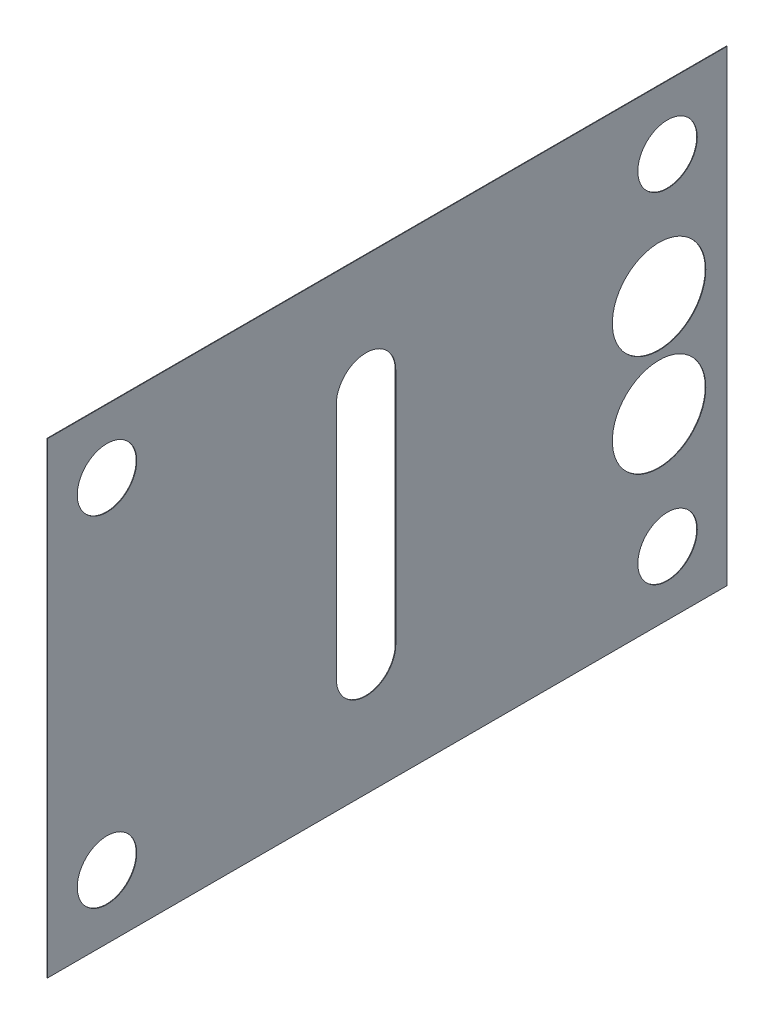
ISO-10303-21;
HEADER;
FILE_DESCRIPTION(('STEP AP214'),'2;1');
FILE_NAME('part.step','',(''),(''),'','','');
FILE_SCHEMA(('AUTOMOTIVE_DESIGN { 1 0 10303 214 1 1 1 1 }'));
ENDSEC;
DATA;
#1=APPLICATION_CONTEXT('core data for automotive mechanical design processes');
#2=APPLICATION_PROTOCOL_DEFINITION('international standard','automotive_design',2000,#1);
#3=PRODUCT_CONTEXT('',#1,'mechanical');
#4=PRODUCT('Part','Part','',(#3));
#5=PRODUCT_RELATED_PRODUCT_CATEGORY('part','',(#4));
#6=PRODUCT_DEFINITION_FORMATION('','',#4);
#7=PRODUCT_DEFINITION_CONTEXT('part definition',#1,'design');
#8=PRODUCT_DEFINITION('design','',#6,#7);
#9=PRODUCT_DEFINITION_SHAPE('','',#8);
#10=(LENGTH_UNIT() NAMED_UNIT(*) SI_UNIT(.MILLI.,.METRE.));
#11=(NAMED_UNIT(*) PLANE_ANGLE_UNIT() SI_UNIT($,.RADIAN.));
#12=(NAMED_UNIT(*) SI_UNIT($,.STERADIAN.) SOLID_ANGLE_UNIT());
#13=UNCERTAINTY_MEASURE_WITH_UNIT(LENGTH_MEASURE(1.E-05),#10,'distance_accuracy_value','');
#14=(GEOMETRIC_REPRESENTATION_CONTEXT(3) GLOBAL_UNCERTAINTY_ASSIGNED_CONTEXT((#13)) GLOBAL_UNIT_ASSIGNED_CONTEXT((#10,
#11,#12)) REPRESENTATION_CONTEXT('',''));
#15=CARTESIAN_POINT('',(0.,0.,0.));
#16=DIRECTION('',(0.,0.,1.));
#17=DIRECTION('',(1.,0.,0.));
#18=AXIS2_PLACEMENT_3D('',#15,#16,#17);
#19=CARTESIAN_POINT('',(0.127,55.,80.));
#20=DIRECTION('',(0.,0.,-1.));
#21=DIRECTION('',(-1.,0.,0.));
#22=AXIS2_PLACEMENT_3D('',#19,#20,#21);
#23=PLANE('',#22);
#24=DIRECTION('',(0.,-1.,0.));
#25=VECTOR('',#24,1.);
#26=CARTESIAN_POINT('',(0.,55.,80.));
#27=LINE('',#26,#25);
#28=CARTESIAN_POINT('',(0.,55.,80.));
#29=VERTEX_POINT('',#28);
#30=CARTESIAN_POINT('',(0.,-55.,80.));
#31=VERTEX_POINT('',#30);
#32=EDGE_CURVE('E161',#29,#31,#27,.T.);
#33=ORIENTED_EDGE('',*,*,#32,.T.);
#34=DIRECTION('',(-1.,0.,0.));
#35=VECTOR('',#34,1.);
#36=CARTESIAN_POINT('',(0.127,-55.,80.));
#37=LINE('',#36,#35);
#38=CARTESIAN_POINT('',(0.127,-55.,80.));
#39=VERTEX_POINT('',#38);
#40=EDGE_CURVE('E11',#39,#31,#37,.T.);
#41=ORIENTED_EDGE('',*,*,#40,.F.);
#42=DIRECTION('',(0.,-1.,0.));
#43=VECTOR('',#42,1.);
#44=CARTESIAN_POINT('',(0.127,55.,80.));
#45=LINE('',#44,#43);
#46=CARTESIAN_POINT('',(0.127,55.,80.));
#47=VERTEX_POINT('',#46);
#48=EDGE_CURVE('E162',#47,#39,#45,.T.);
#49=ORIENTED_EDGE('',*,*,#48,.F.);
#50=DIRECTION('',(-1.,0.,0.));
#51=VECTOR('',#50,1.);
#52=CARTESIAN_POINT('',(0.127,55.,80.));
#53=LINE('',#52,#51);
#54=EDGE_CURVE('E172',#47,#29,#53,.T.);
#55=ORIENTED_EDGE('',*,*,#54,.T.);
#56=EDGE_LOOP('',(#33,#41,#49,#55));
#57=FACE_BOUND('',#56,.T.);
#58=ADVANCED_FACE('F34',(#57),#23,.F.);
#59=CARTESIAN_POINT('',(0.127,-55.,80.));
#60=DIRECTION('',(0.,1.,0.));
#61=DIRECTION('',(0.,0.,1.));
#62=AXIS2_PLACEMENT_3D('',#59,#60,#61);
#63=PLANE('',#62);
#64=DIRECTION('',(0.,0.,-1.));
#65=VECTOR('',#64,1.);
#66=CARTESIAN_POINT('',(0.,-55.,80.));
#67=LINE('',#66,#65);
#68=CARTESIAN_POINT('',(0.,-55.,-80.));
#69=VERTEX_POINT('',#68);
#70=EDGE_CURVE('E175',#31,#69,#67,.T.);
#71=ORIENTED_EDGE('',*,*,#70,.T.);
#72=DIRECTION('',(-1.,0.,0.));
#73=VECTOR('',#72,1.);
#74=CARTESIAN_POINT('',(0.127,-55.,-80.));
#75=LINE('',#74,#73);
#76=CARTESIAN_POINT('',(0.127,-55.,-80.));
#77=VERTEX_POINT('',#76);
#78=EDGE_CURVE('E41',#77,#69,#75,.T.);
#79=ORIENTED_EDGE('',*,*,#78,.F.);
#80=DIRECTION('',(0.,0.,-1.));
#81=VECTOR('',#80,1.);
#82=CARTESIAN_POINT('',(0.127,-55.,80.));
#83=LINE('',#82,#81);
#84=EDGE_CURVE('E165',#39,#77,#83,.T.);
#85=ORIENTED_EDGE('',*,*,#84,.F.);
#86=ORIENTED_EDGE('',*,*,#40,.T.);
#87=EDGE_LOOP('',(#71,#79,#85,#86));
#88=FACE_BOUND('',#87,.T.);
#89=ADVANCED_FACE('F204',(#88),#63,.F.);
#90=CARTESIAN_POINT('',(0.127,55.,-80.));
#91=DIRECTION('',(0.,0.,1.));
#92=DIRECTION('',(0.,-1.,0.));
#93=AXIS2_PLACEMENT_3D('',#90,#91,#92);
#94=PLANE('',#93);
#95=DIRECTION('',(0.,1.,0.));
#96=VECTOR('',#95,1.);
#97=CARTESIAN_POINT('',(0.,55.,-80.));
#98=LINE('',#97,#96);
#99=CARTESIAN_POINT('',(0.,55.,-80.));
#100=VERTEX_POINT('',#99);
#101=EDGE_CURVE('E177',#69,#100,#98,.T.);
#102=ORIENTED_EDGE('',*,*,#101,.T.);
#103=DIRECTION('',(-1.,0.,0.));
#104=VECTOR('',#103,1.);
#105=CARTESIAN_POINT('',(0.127,55.,-80.));
#106=LINE('',#105,#104);
#107=CARTESIAN_POINT('',(0.127,55.,-80.));
#108=VERTEX_POINT('',#107);
#109=EDGE_CURVE('E182',#108,#100,#106,.T.);
#110=ORIENTED_EDGE('',*,*,#109,.F.);
#111=DIRECTION('',(0.,1.,0.));
#112=VECTOR('',#111,1.);
#113=CARTESIAN_POINT('',(0.127,55.,-80.));
#114=LINE('',#113,#112);
#115=EDGE_CURVE('E168',#77,#108,#114,.T.);
#116=ORIENTED_EDGE('',*,*,#115,.F.);
#117=ORIENTED_EDGE('',*,*,#78,.T.);
#118=EDGE_LOOP('',(#102,#110,#116,#117));
#119=FACE_BOUND('',#118,.T.);
#120=ADVANCED_FACE('F189',(#119),#94,.F.);
#121=CARTESIAN_POINT('',(0.127,55.,80.));
#122=DIRECTION('',(0.,-1.,0.));
#123=DIRECTION('',(0.,0.,-1.));
#124=AXIS2_PLACEMENT_3D('',#121,#122,#123);
#125=PLANE('',#124);
#126=DIRECTION('',(0.,0.,1.));
#127=VECTOR('',#126,1.);
#128=CARTESIAN_POINT('',(0.,55.,80.));
#129=LINE('',#128,#127);
#130=EDGE_CURVE('E166',#100,#29,#129,.T.);
#131=ORIENTED_EDGE('',*,*,#130,.T.);
#132=ORIENTED_EDGE('',*,*,#54,.F.);
#133=DIRECTION('',(0.,0.,1.));
#134=VECTOR('',#133,1.);
#135=CARTESIAN_POINT('',(0.127,55.,80.));
#136=LINE('',#135,#134);
#137=EDGE_CURVE('E170',#108,#47,#136,.T.);
#138=ORIENTED_EDGE('',*,*,#137,.F.);
#139=ORIENTED_EDGE('',*,*,#109,.T.);
#140=EDGE_LOOP('',(#131,#132,#138,#139));
#141=FACE_BOUND('',#140,.T.);
#142=ADVANCED_FACE('F197',(#141),#125,.F.);
#143=CARTESIAN_POINT('',(0.127,0.,0.));
#144=DIRECTION('',(1.,0.,0.));
#145=DIRECTION('',(0.,0.,-1.));
#146=AXIS2_PLACEMENT_3D('',#143,#144,#145);
#147=PLANE('',#146);
#148=CARTESIAN_POINT('',(0.127,12.,-64.));
#149=DIRECTION('',(1.,0.,0.));
#150=DIRECTION('',(0.,0.,-1.));
#151=AXIS2_PLACEMENT_3D('',#148,#149,#150);
#152=CIRCLE('',#151,11.);
#153=CARTESIAN_POINT('',(0.127,12.,-75.));
#154=VERTEX_POINT('',#153);
#155=EDGE_CURVE('E262',#154,#154,#152,.T.);
#156=ORIENTED_EDGE('',*,*,#155,.F.);
#157=EDGE_LOOP('',(#156));
#158=FACE_BOUND('',#157,.T.);
#159=CARTESIAN_POINT('',(0.127,-12.,-64.));
#160=DIRECTION('',(1.,0.,0.));
#161=DIRECTION('',(0.,0.,-1.));
#162=AXIS2_PLACEMENT_3D('',#159,#160,#161);
#163=CIRCLE('',#162,11.);
#164=CARTESIAN_POINT('',(0.127,-12.,-75.));
#165=VERTEX_POINT('',#164);
#166=EDGE_CURVE('E264',#165,#165,#163,.T.);
#167=ORIENTED_EDGE('',*,*,#166,.F.);
#168=EDGE_LOOP('',(#167));
#169=FACE_BOUND('',#168,.T.);
#170=CARTESIAN_POINT('',(0.127,28.,5.));
#171=DIRECTION('',(1.,0.,0.));
#172=DIRECTION('',(0.,0.,-1.));
#173=AXIS2_PLACEMENT_3D('',#170,#171,#172);
#174=CIRCLE('',#173,6.99999999999999);
#175=CARTESIAN_POINT('',(0.127,28.,-1.99999999999998));
#176=VERTEX_POINT('',#175);
#177=CARTESIAN_POINT('',(0.127,28.,12.));
#178=VERTEX_POINT('',#177);
#179=EDGE_CURVE('E48',#176,#178,#174,.T.);
#180=ORIENTED_EDGE('',*,*,#179,.F.);
#181=DIRECTION('',(0.,1.,0.));
#182=VECTOR('',#181,1.);
#183=CARTESIAN_POINT('',(0.127,28.,-1.99999999999998));
#184=LINE('',#183,#182);
#185=CARTESIAN_POINT('',(0.127,-28.,-2.));
#186=VERTEX_POINT('',#185);
#187=EDGE_CURVE('E116',#186,#176,#184,.T.);
#188=ORIENTED_EDGE('',*,*,#187,.F.);
#189=CARTESIAN_POINT('',(0.127,-28.,5.));
#190=DIRECTION('',(1.,0.,0.));
#191=DIRECTION('',(0.,0.,-1.));
#192=AXIS2_PLACEMENT_3D('',#189,#190,#191);
#193=CIRCLE('',#192,7.);
#194=CARTESIAN_POINT('',(0.127,-28.,12.));
#195=VERTEX_POINT('',#194);
#196=EDGE_CURVE('E119',#195,#186,#193,.T.);
#197=ORIENTED_EDGE('',*,*,#196,.F.);
#198=DIRECTION('',(0.,-1.,0.));
#199=VECTOR('',#198,1.);
#200=CARTESIAN_POINT('',(0.127,28.,12.));
#201=LINE('',#200,#199);
#202=EDGE_CURVE('E128',#178,#195,#201,.T.);
#203=ORIENTED_EDGE('',*,*,#202,.F.);
#204=EDGE_LOOP('',(#180,#188,#197,#203));
#205=FACE_BOUND('',#204,.T.);
#206=CARTESIAN_POINT('',(0.127,40.,66.));
#207=DIRECTION('',(1.,0.,0.));
#208=DIRECTION('',(0.,0.,-1.));
#209=AXIS2_PLACEMENT_3D('',#206,#207,#208);
#210=CIRCLE('',#209,7.);
#211=CARTESIAN_POINT('',(0.127,40.,59.));
#212=VERTEX_POINT('',#211);
#213=EDGE_CURVE('E134',#212,#212,#210,.T.);
#214=ORIENTED_EDGE('',*,*,#213,.F.);
#215=EDGE_LOOP('',(#214));
#216=FACE_BOUND('',#215,.T.);
#217=CARTESIAN_POINT('',(0.127,40.,-66.));
#218=DIRECTION('',(1.,0.,0.));
#219=DIRECTION('',(0.,0.,-1.));
#220=AXIS2_PLACEMENT_3D('',#217,#218,#219);
#221=CIRCLE('',#220,7.);
#222=CARTESIAN_POINT('',(0.127,40.,-73.));
#223=VERTEX_POINT('',#222);
#224=EDGE_CURVE('E143',#223,#223,#221,.T.);
#225=ORIENTED_EDGE('',*,*,#224,.F.);
#226=EDGE_LOOP('',(#225));
#227=FACE_BOUND('',#226,.T.);
#228=CARTESIAN_POINT('',(0.127,-40.,-66.));
#229=DIRECTION('',(1.,0.,0.));
#230=DIRECTION('',(0.,0.,-1.));
#231=AXIS2_PLACEMENT_3D('',#228,#229,#230);
#232=CIRCLE('',#231,7.);
#233=CARTESIAN_POINT('',(0.127,-40.,-73.));
#234=VERTEX_POINT('',#233);
#235=EDGE_CURVE('E149',#234,#234,#232,.T.);
#236=ORIENTED_EDGE('',*,*,#235,.F.);
#237=EDGE_LOOP('',(#236));
#238=FACE_BOUND('',#237,.T.);
#239=CARTESIAN_POINT('',(0.127,-40.,66.));
#240=DIRECTION('',(1.,0.,0.));
#241=DIRECTION('',(0.,0.,-1.));
#242=AXIS2_PLACEMENT_3D('',#239,#240,#241);
#243=CIRCLE('',#242,7.);
#244=CARTESIAN_POINT('',(0.127,-40.,59.));
#245=VERTEX_POINT('',#244);
#246=EDGE_CURVE('E155',#245,#245,#243,.T.);
#247=ORIENTED_EDGE('',*,*,#246,.F.);
#248=EDGE_LOOP('',(#247));
#249=FACE_BOUND('',#248,.T.);
#250=ORIENTED_EDGE('',*,*,#48,.T.);
#251=ORIENTED_EDGE('',*,*,#84,.T.);
#252=ORIENTED_EDGE('',*,*,#115,.T.);
#253=ORIENTED_EDGE('',*,*,#137,.T.);
#254=EDGE_LOOP('',(#250,#251,#252,#253));
#255=FACE_BOUND('',#254,.T.);
#256=ADVANCED_FACE('F203',(#158,#169,#205,#216,#227,#238,#249,#255),#147,.T.);
#257=CARTESIAN_POINT('',(0.,0.,0.));
#258=DIRECTION('',(1.,0.,0.));
#259=DIRECTION('',(0.,0.,-1.));
#260=AXIS2_PLACEMENT_3D('',#257,#258,#259);
#261=PLANE('',#260);
#262=CARTESIAN_POINT('',(0.,12.,-64.));
#263=DIRECTION('',(1.,0.,0.));
#264=DIRECTION('',(0.,0.,-1.));
#265=AXIS2_PLACEMENT_3D('',#262,#263,#264);
#266=CIRCLE('',#265,11.);
#267=CARTESIAN_POINT('',(0.,12.,-75.));
#268=VERTEX_POINT('',#267);
#269=EDGE_CURVE('E259',#268,#268,#266,.T.);
#270=ORIENTED_EDGE('',*,*,#269,.T.);
#271=EDGE_LOOP('',(#270));
#272=FACE_BOUND('',#271,.T.);
#273=CARTESIAN_POINT('',(0.,-12.,-64.));
#274=DIRECTION('',(1.,0.,0.));
#275=DIRECTION('',(0.,0.,-1.));
#276=AXIS2_PLACEMENT_3D('',#273,#274,#275);
#277=CIRCLE('',#276,11.);
#278=CARTESIAN_POINT('',(0.,-12.,-75.));
#279=VERTEX_POINT('',#278);
#280=EDGE_CURVE('E122',#279,#279,#277,.T.);
#281=ORIENTED_EDGE('',*,*,#280,.T.);
#282=EDGE_LOOP('',(#281));
#283=FACE_BOUND('',#282,.T.);
#284=DIRECTION('',(0.,1.,0.));
#285=VECTOR('',#284,1.);
#286=CARTESIAN_POINT('',(0.,28.,-1.99999999999998));
#287=LINE('',#286,#285);
#288=CARTESIAN_POINT('',(0.,-28.,-2.));
#289=VERTEX_POINT('',#288);
#290=CARTESIAN_POINT('',(0.,28.,-1.99999999999998));
#291=VERTEX_POINT('',#290);
#292=EDGE_CURVE('E106',#289,#291,#287,.T.);
#293=ORIENTED_EDGE('',*,*,#292,.T.);
#294=CARTESIAN_POINT('',(0.,28.,5.));
#295=DIRECTION('',(1.,0.,0.));
#296=DIRECTION('',(0.,0.,-1.));
#297=AXIS2_PLACEMENT_3D('',#294,#295,#296);
#298=CIRCLE('',#297,6.99999999999999);
#299=CARTESIAN_POINT('',(0.,28.,12.));
#300=VERTEX_POINT('',#299);
#301=EDGE_CURVE('E100',#291,#300,#298,.T.);
#302=ORIENTED_EDGE('',*,*,#301,.T.);
#303=DIRECTION('',(0.,-1.,0.));
#304=VECTOR('',#303,1.);
#305=CARTESIAN_POINT('',(0.,28.,12.));
#306=LINE('',#305,#304);
#307=CARTESIAN_POINT('',(0.,-28.,12.));
#308=VERTEX_POINT('',#307);
#309=EDGE_CURVE('E109',#300,#308,#306,.T.);
#310=ORIENTED_EDGE('',*,*,#309,.T.);
#311=CARTESIAN_POINT('',(0.,-28.,5.));
#312=DIRECTION('',(1.,0.,0.));
#313=DIRECTION('',(0.,0.,-1.));
#314=AXIS2_PLACEMENT_3D('',#311,#312,#313);
#315=CIRCLE('',#314,7.);
#316=EDGE_CURVE('E56',#308,#289,#315,.T.);
#317=ORIENTED_EDGE('',*,*,#316,.T.);
#318=EDGE_LOOP('',(#293,#302,#310,#317));
#319=FACE_BOUND('',#318,.T.);
#320=CARTESIAN_POINT('',(0.,40.,66.));
#321=DIRECTION('',(1.,0.,0.));
#322=DIRECTION('',(0.,0.,-1.));
#323=AXIS2_PLACEMENT_3D('',#320,#321,#322);
#324=CIRCLE('',#323,7.);
#325=CARTESIAN_POINT('',(0.,40.,59.));
#326=VERTEX_POINT('',#325);
#327=EDGE_CURVE('E140',#326,#326,#324,.T.);
#328=ORIENTED_EDGE('',*,*,#327,.T.);
#329=EDGE_LOOP('',(#328));
#330=FACE_BOUND('',#329,.T.);
#331=CARTESIAN_POINT('',(0.,40.,-66.));
#332=DIRECTION('',(1.,0.,0.));
#333=DIRECTION('',(0.,0.,-1.));
#334=AXIS2_PLACEMENT_3D('',#331,#332,#333);
#335=CIRCLE('',#334,7.);
#336=CARTESIAN_POINT('',(0.,40.,-73.));
#337=VERTEX_POINT('',#336);
#338=EDGE_CURVE('E146',#337,#337,#335,.T.);
#339=ORIENTED_EDGE('',*,*,#338,.T.);
#340=EDGE_LOOP('',(#339));
#341=FACE_BOUND('',#340,.T.);
#342=CARTESIAN_POINT('',(0.,-40.,-66.));
#343=DIRECTION('',(1.,0.,0.));
#344=DIRECTION('',(0.,0.,-1.));
#345=AXIS2_PLACEMENT_3D('',#342,#343,#344);
#346=CIRCLE('',#345,7.);
#347=CARTESIAN_POINT('',(0.,-40.,-73.));
#348=VERTEX_POINT('',#347);
#349=EDGE_CURVE('E152',#348,#348,#346,.T.);
#350=ORIENTED_EDGE('',*,*,#349,.T.);
#351=EDGE_LOOP('',(#350));
#352=FACE_BOUND('',#351,.T.);
#353=CARTESIAN_POINT('',(0.,-40.,66.));
#354=DIRECTION('',(1.,0.,0.));
#355=DIRECTION('',(0.,0.,-1.));
#356=AXIS2_PLACEMENT_3D('',#353,#354,#355);
#357=CIRCLE('',#356,7.);
#358=CARTESIAN_POINT('',(0.,-40.,59.));
#359=VERTEX_POINT('',#358);
#360=EDGE_CURVE('E158',#359,#359,#357,.T.);
#361=ORIENTED_EDGE('',*,*,#360,.T.);
#362=EDGE_LOOP('',(#361));
#363=FACE_BOUND('',#362,.T.);
#364=ORIENTED_EDGE('',*,*,#32,.F.);
#365=ORIENTED_EDGE('',*,*,#130,.F.);
#366=ORIENTED_EDGE('',*,*,#101,.F.);
#367=ORIENTED_EDGE('',*,*,#70,.F.);
#368=EDGE_LOOP('',(#364,#365,#366,#367));
#369=FACE_BOUND('',#368,.T.);
#370=ADVANCED_FACE('F113',(#272,#283,#319,#330,#341,#352,#363,#369),#261,.F.);
#371=CARTESIAN_POINT('',(0.127,-40.,66.));
#372=DIRECTION('',(1.,0.,0.));
#373=DIRECTION('',(0.,0.,-1.));
#374=AXIS2_PLACEMENT_3D('',#371,#372,#373);
#375=CYLINDRICAL_SURFACE('',#374,7.);
#376=ORIENTED_EDGE('',*,*,#360,.F.);
#377=EDGE_LOOP('',(#376));
#378=FACE_BOUND('',#377,.T.);
#379=ORIENTED_EDGE('',*,*,#246,.T.);
#380=EDGE_LOOP('',(#379));
#381=FACE_BOUND('',#380,.T.);
#382=ADVANCED_FACE('F216',(#378,#381),#375,.F.);
#383=CARTESIAN_POINT('',(0.127,-40.,-66.));
#384=DIRECTION('',(1.,0.,0.));
#385=DIRECTION('',(0.,0.,-1.));
#386=AXIS2_PLACEMENT_3D('',#383,#384,#385);
#387=CYLINDRICAL_SURFACE('',#386,7.);
#388=ORIENTED_EDGE('',*,*,#349,.F.);
#389=EDGE_LOOP('',(#388));
#390=FACE_BOUND('',#389,.T.);
#391=ORIENTED_EDGE('',*,*,#235,.T.);
#392=EDGE_LOOP('',(#391));
#393=FACE_BOUND('',#392,.T.);
#394=ADVANCED_FACE('F223',(#390,#393),#387,.F.);
#395=CARTESIAN_POINT('',(0.127,40.,-66.));
#396=DIRECTION('',(1.,0.,0.));
#397=DIRECTION('',(0.,0.,-1.));
#398=AXIS2_PLACEMENT_3D('',#395,#396,#397);
#399=CYLINDRICAL_SURFACE('',#398,7.);
#400=ORIENTED_EDGE('',*,*,#338,.F.);
#401=EDGE_LOOP('',(#400));
#402=FACE_BOUND('',#401,.T.);
#403=ORIENTED_EDGE('',*,*,#224,.T.);
#404=EDGE_LOOP('',(#403));
#405=FACE_BOUND('',#404,.T.);
#406=ADVANCED_FACE('F227',(#402,#405),#399,.F.);
#407=CARTESIAN_POINT('',(0.127,40.,66.));
#408=DIRECTION('',(1.,0.,0.));
#409=DIRECTION('',(0.,0.,-1.));
#410=AXIS2_PLACEMENT_3D('',#407,#408,#409);
#411=CYLINDRICAL_SURFACE('',#410,7.);
#412=ORIENTED_EDGE('',*,*,#327,.F.);
#413=EDGE_LOOP('',(#412));
#414=FACE_BOUND('',#413,.T.);
#415=ORIENTED_EDGE('',*,*,#213,.T.);
#416=EDGE_LOOP('',(#415));
#417=FACE_BOUND('',#416,.T.);
#418=ADVANCED_FACE('F231',(#414,#417),#411,.F.);
#419=CARTESIAN_POINT('',(0.,28.,5.));
#420=DIRECTION('',(1.,0.,0.));
#421=DIRECTION('',(0.,0.,-1.));
#422=AXIS2_PLACEMENT_3D('',#419,#420,#421);
#423=CYLINDRICAL_SURFACE('',#422,6.99999999999999);
#424=ORIENTED_EDGE('',*,*,#179,.T.);
#425=DIRECTION('',(1.,0.,0.));
#426=VECTOR('',#425,1.);
#427=CARTESIAN_POINT('',(0.,28.,12.));
#428=LINE('',#427,#426);
#429=EDGE_CURVE('E96',#300,#178,#428,.T.);
#430=ORIENTED_EDGE('',*,*,#429,.F.);
#431=ORIENTED_EDGE('',*,*,#301,.F.);
#432=DIRECTION('',(1.,0.,0.));
#433=VECTOR('',#432,1.);
#434=CARTESIAN_POINT('',(0.,28.,-1.99999999999998));
#435=LINE('',#434,#433);
#436=EDGE_CURVE('E132',#291,#176,#435,.T.);
#437=ORIENTED_EDGE('',*,*,#436,.T.);
#438=EDGE_LOOP('',(#424,#430,#431,#437));
#439=FACE_BOUND('',#438,.T.);
#440=ADVANCED_FACE('F98',(#439),#423,.F.);
#441=CARTESIAN_POINT('',(0.,28.,-1.99999999999998));
#442=DIRECTION('',(0.,0.,-1.));
#443=DIRECTION('',(0.,1.,0.));
#444=AXIS2_PLACEMENT_3D('',#441,#442,#443);
#445=PLANE('',#444);
#446=ORIENTED_EDGE('',*,*,#187,.T.);
#447=ORIENTED_EDGE('',*,*,#436,.F.);
#448=ORIENTED_EDGE('',*,*,#292,.F.);
#449=DIRECTION('',(1.,0.,0.));
#450=VECTOR('',#449,1.);
#451=CARTESIAN_POINT('',(0.,-28.,-2.));
#452=LINE('',#451,#450);
#453=EDGE_CURVE('E135',#289,#186,#452,.T.);
#454=ORIENTED_EDGE('',*,*,#453,.T.);
#455=EDGE_LOOP('',(#446,#447,#448,#454));
#456=FACE_BOUND('',#455,.T.);
#457=ADVANCED_FACE('F238',(#456),#445,.F.);
#458=CARTESIAN_POINT('',(0.,-28.,5.));
#459=DIRECTION('',(1.,0.,0.));
#460=DIRECTION('',(0.,0.,-1.));
#461=AXIS2_PLACEMENT_3D('',#458,#459,#460);
#462=CYLINDRICAL_SURFACE('',#461,7.);
#463=ORIENTED_EDGE('',*,*,#196,.T.);
#464=ORIENTED_EDGE('',*,*,#453,.F.);
#465=ORIENTED_EDGE('',*,*,#316,.F.);
#466=DIRECTION('',(1.,0.,0.));
#467=VECTOR('',#466,1.);
#468=CARTESIAN_POINT('',(0.,-28.,12.));
#469=LINE('',#468,#467);
#470=EDGE_CURVE('E105',#308,#195,#469,.T.);
#471=ORIENTED_EDGE('',*,*,#470,.T.);
#472=EDGE_LOOP('',(#463,#464,#465,#471));
#473=FACE_BOUND('',#472,.T.);
#474=ADVANCED_FACE('F242',(#473),#462,.F.);
#475=CARTESIAN_POINT('',(0.,28.,12.));
#476=DIRECTION('',(0.,0.,1.));
#477=DIRECTION('',(1.,0.,0.));
#478=AXIS2_PLACEMENT_3D('',#475,#476,#477);
#479=PLANE('',#478);
#480=ORIENTED_EDGE('',*,*,#202,.T.);
#481=ORIENTED_EDGE('',*,*,#470,.F.);
#482=ORIENTED_EDGE('',*,*,#309,.F.);
#483=ORIENTED_EDGE('',*,*,#429,.T.);
#484=EDGE_LOOP('',(#480,#481,#482,#483));
#485=FACE_BOUND('',#484,.T.);
#486=ADVANCED_FACE('F110',(#485),#479,.F.);
#487=CARTESIAN_POINT('',(0.127,-12.,-64.));
#488=DIRECTION('',(1.,0.,0.));
#489=DIRECTION('',(0.,0.,-1.));
#490=AXIS2_PLACEMENT_3D('',#487,#488,#489);
#491=CYLINDRICAL_SURFACE('',#490,11.);
#492=ORIENTED_EDGE('',*,*,#280,.F.);
#493=EDGE_LOOP('',(#492));
#494=FACE_BOUND('',#493,.T.);
#495=ORIENTED_EDGE('',*,*,#166,.T.);
#496=EDGE_LOOP('',(#495));
#497=FACE_BOUND('',#496,.T.);
#498=ADVANCED_FACE('F241',(#494,#497),#491,.F.);
#499=CARTESIAN_POINT('',(0.127,12.,-64.));
#500=DIRECTION('',(1.,0.,0.));
#501=DIRECTION('',(0.,0.,-1.));
#502=AXIS2_PLACEMENT_3D('',#499,#500,#501);
#503=CYLINDRICAL_SURFACE('',#502,11.);
#504=ORIENTED_EDGE('',*,*,#269,.F.);
#505=EDGE_LOOP('',(#504));
#506=FACE_BOUND('',#505,.T.);
#507=ORIENTED_EDGE('',*,*,#155,.T.);
#508=EDGE_LOOP('',(#507));
#509=FACE_BOUND('',#508,.T.);
#510=ADVANCED_FACE('F250',(#506,#509),#503,.F.);
#511=CLOSED_SHELL('',(#58,#89,#120,#142,#256,#370,#382,#394,#406,#418,#440,#457,#474,#486,#498,#510));
#512=MANIFOLD_SOLID_BREP('B2',#511);
#513=ADVANCED_BREP_SHAPE_REPRESENTATION('',(#18,#512),#14);
#514=SHAPE_DEFINITION_REPRESENTATION(#9,#513);
ENDSEC;
END-ISO-10303-21;
